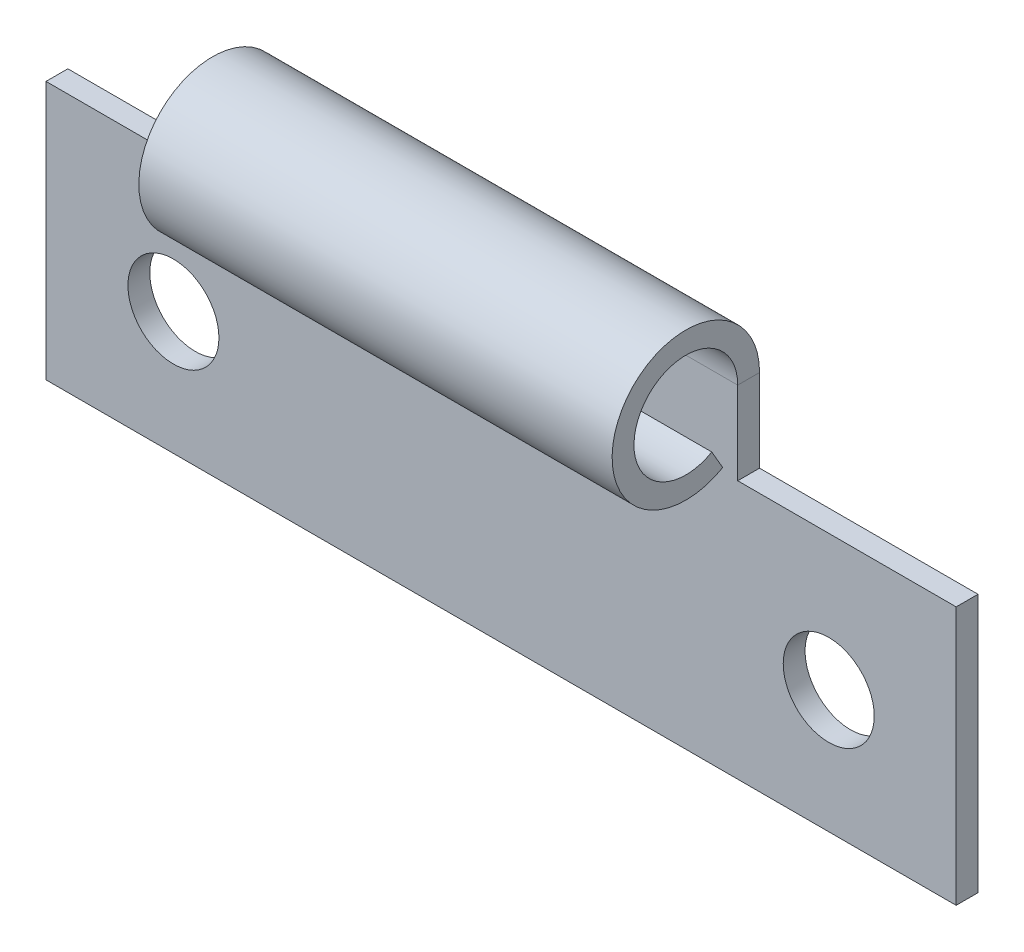
ISO-10303-21;
HEADER;
FILE_DESCRIPTION(('STEP AP214'),'2;1');
FILE_NAME('part.step','',(''),(''),'','','');
FILE_SCHEMA(('AUTOMOTIVE_DESIGN { 1 0 10303 214 1 1 1 1 }'));
ENDSEC;
DATA;
#1=APPLICATION_CONTEXT('core data for automotive mechanical design processes');
#2=APPLICATION_PROTOCOL_DEFINITION('international standard','automotive_design',2000,#1);
#3=PRODUCT_CONTEXT('',#1,'mechanical');
#4=PRODUCT('Part','Part','',(#3));
#5=PRODUCT_RELATED_PRODUCT_CATEGORY('part','',(#4));
#6=PRODUCT_DEFINITION_FORMATION('','',#4);
#7=PRODUCT_DEFINITION_CONTEXT('part definition',#1,'design');
#8=PRODUCT_DEFINITION('design','',#6,#7);
#9=PRODUCT_DEFINITION_SHAPE('','',#8);
#10=(LENGTH_UNIT() NAMED_UNIT(*) SI_UNIT(.MILLI.,.METRE.));
#11=(NAMED_UNIT(*) PLANE_ANGLE_UNIT() SI_UNIT($,.RADIAN.));
#12=(NAMED_UNIT(*) SI_UNIT($,.STERADIAN.) SOLID_ANGLE_UNIT());
#13=UNCERTAINTY_MEASURE_WITH_UNIT(LENGTH_MEASURE(1.E-05),#10,'distance_accuracy_value','');
#14=(GEOMETRIC_REPRESENTATION_CONTEXT(3) GLOBAL_UNCERTAINTY_ASSIGNED_CONTEXT((#13)) GLOBAL_UNIT_ASSIGNED_CONTEXT((#10,
#11,#12)) REPRESENTATION_CONTEXT('',''));
#15=CARTESIAN_POINT('',(0.,0.,0.));
#16=DIRECTION('',(0.,0.,1.));
#17=DIRECTION('',(1.,0.,0.));
#18=AXIS2_PLACEMENT_3D('',#15,#16,#17);
#19=CARTESIAN_POINT('',(-13.,13.425,-1.2));
#20=DIRECTION('',(1.,0.,0.));
#21=DIRECTION('',(0.,1.,0.));
#22=AXIS2_PLACEMENT_3D('',#19,#20,#21);
#23=PLANE('',#22);
#24=DIRECTION('',(0.,1.,0.));
#25=VECTOR('',#24,1.);
#26=CARTESIAN_POINT('',(-13.,0.,0.));
#27=LINE('',#26,#25);
#28=CARTESIAN_POINT('',(-13.,4.825,0.));
#29=VERTEX_POINT('',#28);
#30=CARTESIAN_POINT('',(-13.,9.375,0.));
#31=VERTEX_POINT('',#30);
#32=EDGE_CURVE('E207',#29,#31,#27,.T.);
#33=ORIENTED_EDGE('',*,*,#32,.T.);
#34=DIRECTION('',(0.,0.,-1.));
#35=VECTOR('',#34,1.);
#36=CARTESIAN_POINT('',(-13.,9.375,0.));
#37=LINE('',#36,#35);
#38=CARTESIAN_POINT('',(-13.,9.375,-1.2));
#39=VERTEX_POINT('',#38);
#40=EDGE_CURVE('E12',#31,#39,#37,.T.);
#41=ORIENTED_EDGE('',*,*,#40,.T.);
#42=DIRECTION('',(0.,1.,0.));
#43=VECTOR('',#42,1.);
#44=CARTESIAN_POINT('',(-13.,13.425,-1.2));
#45=LINE('',#44,#43);
#46=CARTESIAN_POINT('',(-13.,4.825,-1.2));
#47=VERTEX_POINT('',#46);
#48=EDGE_CURVE('E129',#47,#39,#45,.T.);
#49=ORIENTED_EDGE('',*,*,#48,.F.);
#50=DIRECTION('',(0.,0.,1.));
#51=VECTOR('',#50,1.);
#52=CARTESIAN_POINT('',(-13.,4.825,-1.2));
#53=LINE('',#52,#51);
#54=EDGE_CURVE('E124',#47,#29,#53,.T.);
#55=ORIENTED_EDGE('',*,*,#54,.T.);
#56=EDGE_LOOP('',(#33,#41,#49,#55));
#57=FACE_BOUND('',#56,.T.);
#58=ADVANCED_FACE('F43',(#57),#23,.F.);
#59=CARTESIAN_POINT('',(13.,13.425,-1.2));
#60=DIRECTION('',(-1.,0.,0.));
#61=DIRECTION('',(0.,-1.,0.));
#62=AXIS2_PLACEMENT_3D('',#59,#60,#61);
#63=PLANE('',#62);
#64=DIRECTION('',(0.,-1.,0.));
#65=VECTOR('',#64,1.);
#66=CARTESIAN_POINT('',(13.,13.425,-1.2));
#67=LINE('',#66,#65);
#68=CARTESIAN_POINT('',(13.,9.375,-1.2));
#69=VERTEX_POINT('',#68);
#70=CARTESIAN_POINT('',(13.,4.825,-1.2));
#71=VERTEX_POINT('',#70);
#72=EDGE_CURVE('E183',#69,#71,#67,.T.);
#73=ORIENTED_EDGE('',*,*,#72,.F.);
#74=DIRECTION('',(0.,0.,1.));
#75=VECTOR('',#74,1.);
#76=CARTESIAN_POINT('',(13.,9.375,-1.2));
#77=LINE('',#76,#75);
#78=CARTESIAN_POINT('',(13.,9.375,0.));
#79=VERTEX_POINT('',#78);
#80=EDGE_CURVE('E51',#69,#79,#77,.T.);
#81=ORIENTED_EDGE('',*,*,#80,.T.);
#82=DIRECTION('',(0.,-1.,0.));
#83=VECTOR('',#82,1.);
#84=CARTESIAN_POINT('',(13.,0.,0.));
#85=LINE('',#84,#83);
#86=CARTESIAN_POINT('',(13.,4.825,0.));
#87=VERTEX_POINT('',#86);
#88=EDGE_CURVE('E180',#79,#87,#85,.T.);
#89=ORIENTED_EDGE('',*,*,#88,.T.);
#90=DIRECTION('',(0.,0.,1.));
#91=VECTOR('',#90,1.);
#92=CARTESIAN_POINT('',(13.,4.825,-1.2));
#93=LINE('',#92,#91);
#94=EDGE_CURVE('E244',#71,#87,#93,.T.);
#95=ORIENTED_EDGE('',*,*,#94,.F.);
#96=EDGE_LOOP('',(#73,#81,#89,#95));
#97=FACE_BOUND('',#96,.T.);
#98=ADVANCED_FACE('F178',(#97),#63,.F.);
#99=CARTESIAN_POINT('',(25.,9.375,-1.2));
#100=DIRECTION('',(1.,0.,0.));
#101=DIRECTION('',(0.,0.,-1.));
#102=AXIS2_PLACEMENT_3D('',#99,#100,#101);
#103=PLANE('',#102);
#104=DIRECTION('',(0.,0.,1.));
#105=VECTOR('',#104,1.);
#106=CARTESIAN_POINT('',(25.,4.825,-1.2));
#107=LINE('',#106,#105);
#108=CARTESIAN_POINT('',(25.,4.825,-1.2));
#109=VERTEX_POINT('',#108);
#110=CARTESIAN_POINT('',(25.,4.825,0.));
#111=VERTEX_POINT('',#110);
#112=EDGE_CURVE('E130',#109,#111,#107,.T.);
#113=ORIENTED_EDGE('',*,*,#112,.T.);
#114=DIRECTION('',(0.,1.,0.));
#115=VECTOR('',#114,1.);
#116=CARTESIAN_POINT('',(25.,9.375,0.));
#117=LINE('',#116,#115);
#118=CARTESIAN_POINT('',(25.,-9.375,0.));
#119=VERTEX_POINT('',#118);
#120=EDGE_CURVE('E154',#119,#111,#117,.T.);
#121=ORIENTED_EDGE('',*,*,#120,.F.);
#122=DIRECTION('',(0.,0.,1.));
#123=VECTOR('',#122,1.);
#124=CARTESIAN_POINT('',(25.,-9.375,-1.2));
#125=LINE('',#124,#123);
#126=CARTESIAN_POINT('',(25.,-9.375,-1.2));
#127=VERTEX_POINT('',#126);
#128=EDGE_CURVE('E165',#127,#119,#125,.T.);
#129=ORIENTED_EDGE('',*,*,#128,.F.);
#130=DIRECTION('',(0.,1.,0.));
#131=VECTOR('',#130,1.);
#132=CARTESIAN_POINT('',(25.,9.375,-1.2));
#133=LINE('',#132,#131);
#134=EDGE_CURVE('E150',#127,#109,#133,.T.);
#135=ORIENTED_EDGE('',*,*,#134,.T.);
#136=EDGE_LOOP('',(#113,#121,#129,#135));
#137=FACE_BOUND('',#136,.T.);
#138=ADVANCED_FACE('F45',(#137),#103,.T.);
#139=CARTESIAN_POINT('',(-25.,-9.375,-1.2));
#140=DIRECTION('',(0.,-1.,0.));
#141=DIRECTION('',(0.,0.,-1.));
#142=AXIS2_PLACEMENT_3D('',#139,#140,#141);
#143=PLANE('',#142);
#144=DIRECTION('',(1.,0.,0.));
#145=VECTOR('',#144,1.);
#146=CARTESIAN_POINT('',(-25.,-9.375,0.));
#147=LINE('',#146,#145);
#148=CARTESIAN_POINT('',(-25.,-9.375,0.));
#149=VERTEX_POINT('',#148);
#150=EDGE_CURVE('E162',#149,#119,#147,.T.);
#151=ORIENTED_EDGE('',*,*,#150,.F.);
#152=DIRECTION('',(0.,0.,1.));
#153=VECTOR('',#152,1.);
#154=CARTESIAN_POINT('',(-25.,-9.375,-1.2));
#155=LINE('',#154,#153);
#156=CARTESIAN_POINT('',(-25.,-9.375,-1.2));
#157=VERTEX_POINT('',#156);
#158=EDGE_CURVE('E147',#157,#149,#155,.T.);
#159=ORIENTED_EDGE('',*,*,#158,.F.);
#160=DIRECTION('',(1.,0.,0.));
#161=VECTOR('',#160,1.);
#162=CARTESIAN_POINT('',(-25.,-9.375,-1.2));
#163=LINE('',#162,#161);
#164=EDGE_CURVE('E144',#157,#127,#163,.T.);
#165=ORIENTED_EDGE('',*,*,#164,.T.);
#166=ORIENTED_EDGE('',*,*,#128,.T.);
#167=EDGE_LOOP('',(#151,#159,#165,#166));
#168=FACE_BOUND('',#167,.T.);
#169=ADVANCED_FACE('F236',(#168),#143,.T.);
#170=CARTESIAN_POINT('',(-25.,9.375,-1.2));
#171=DIRECTION('',(-1.,0.,0.));
#172=DIRECTION('',(0.,-1.,0.));
#173=AXIS2_PLACEMENT_3D('',#170,#171,#172);
#174=PLANE('',#173);
#175=DIRECTION('',(0.,0.,1.));
#176=VECTOR('',#175,1.);
#177=CARTESIAN_POINT('',(-25.,4.825,-1.2));
#178=LINE('',#177,#176);
#179=CARTESIAN_POINT('',(-25.,4.825,-1.2));
#180=VERTEX_POINT('',#179);
#181=CARTESIAN_POINT('',(-25.,4.825,0.));
#182=VERTEX_POINT('',#181);
#183=EDGE_CURVE('E121',#180,#182,#178,.T.);
#184=ORIENTED_EDGE('',*,*,#183,.F.);
#185=DIRECTION('',(0.,-1.,0.));
#186=VECTOR('',#185,1.);
#187=CARTESIAN_POINT('',(-25.,9.375,-1.2));
#188=LINE('',#187,#186);
#189=EDGE_CURVE('E136',#180,#157,#188,.T.);
#190=ORIENTED_EDGE('',*,*,#189,.T.);
#191=ORIENTED_EDGE('',*,*,#158,.T.);
#192=DIRECTION('',(0.,-1.,0.));
#193=VECTOR('',#192,1.);
#194=CARTESIAN_POINT('',(-25.,9.375,0.));
#195=LINE('',#194,#193);
#196=EDGE_CURVE('E138',#182,#149,#195,.T.);
#197=ORIENTED_EDGE('',*,*,#196,.F.);
#198=EDGE_LOOP('',(#184,#190,#191,#197));
#199=FACE_BOUND('',#198,.T.);
#200=ADVANCED_FACE('F134',(#199),#174,.T.);
#201=CARTESIAN_POINT('',(0.,0.,-1.2));
#202=DIRECTION('',(0.,0.,1.));
#203=DIRECTION('',(1.,0.,0.));
#204=AXIS2_PLACEMENT_3D('',#201,#202,#203);
#205=PLANE('',#204);
#206=CARTESIAN_POINT('',(-18.,-2.625,-1.2));
#207=DIRECTION('',(0.,0.,1.));
#208=DIRECTION('',(1.,0.,0.));
#209=AXIS2_PLACEMENT_3D('',#206,#207,#208);
#210=CIRCLE('',#209,2.5);
#211=CARTESIAN_POINT('',(-15.5,-2.625,-1.2));
#212=VERTEX_POINT('',#211);
#213=EDGE_CURVE('E223',#212,#212,#210,.T.);
#214=ORIENTED_EDGE('',*,*,#213,.T.);
#215=EDGE_LOOP('',(#214));
#216=FACE_BOUND('',#215,.T.);
#217=CARTESIAN_POINT('',(18.,-2.62499999999999,-1.2));
#218=DIRECTION('',(0.,0.,1.));
#219=DIRECTION('',(1.,0.,0.));
#220=AXIS2_PLACEMENT_3D('',#217,#218,#219);
#221=CIRCLE('',#220,2.5);
#222=CARTESIAN_POINT('',(20.5,-2.62499999999999,-1.2));
#223=VERTEX_POINT('',#222);
#224=EDGE_CURVE('E218',#223,#223,#221,.T.);
#225=ORIENTED_EDGE('',*,*,#224,.T.);
#226=EDGE_LOOP('',(#225));
#227=FACE_BOUND('',#226,.T.);
#228=DIRECTION('',(1.,0.,0.));
#229=VECTOR('',#228,1.);
#230=CARTESIAN_POINT('',(-25.,4.825,-1.2));
#231=LINE('',#230,#229);
#232=EDGE_CURVE('E118',#180,#47,#231,.T.);
#233=ORIENTED_EDGE('',*,*,#232,.T.);
#234=ORIENTED_EDGE('',*,*,#48,.T.);
#235=DIRECTION('',(-1.,0.,0.));
#236=VECTOR('',#235,1.);
#237=CARTESIAN_POINT('',(-25.,9.375,-1.2));
#238=LINE('',#237,#236);
#239=EDGE_CURVE('E145',#69,#39,#238,.T.);
#240=ORIENTED_EDGE('',*,*,#239,.F.);
#241=ORIENTED_EDGE('',*,*,#72,.T.);
#242=DIRECTION('',(1.,0.,0.));
#243=VECTOR('',#242,1.);
#244=CARTESIAN_POINT('',(25.,4.825,-1.2));
#245=LINE('',#244,#243);
#246=EDGE_CURVE('E233',#71,#109,#245,.T.);
#247=ORIENTED_EDGE('',*,*,#246,.T.);
#248=ORIENTED_EDGE('',*,*,#134,.F.);
#249=ORIENTED_EDGE('',*,*,#164,.F.);
#250=ORIENTED_EDGE('',*,*,#189,.F.);
#251=EDGE_LOOP('',(#233,#234,#240,#241,#247,#248,#249,#250));
#252=FACE_BOUND('',#251,.T.);
#253=ADVANCED_FACE('F141',(#216,#227,#252),#205,.F.);
#254=CARTESIAN_POINT('',(0.,0.,0.));
#255=DIRECTION('',(0.,0.,1.));
#256=DIRECTION('',(1.,0.,0.));
#257=AXIS2_PLACEMENT_3D('',#254,#255,#256);
#258=PLANE('',#257);
#259=ORIENTED_EDGE('',*,*,#32,.F.);
#260=DIRECTION('',(1.,0.,0.));
#261=VECTOR('',#260,1.);
#262=CARTESIAN_POINT('',(0.,4.825,0.));
#263=LINE('',#262,#261);
#264=EDGE_CURVE('E175',#182,#29,#263,.T.);
#265=ORIENTED_EDGE('',*,*,#264,.F.);
#266=ORIENTED_EDGE('',*,*,#196,.T.);
#267=ORIENTED_EDGE('',*,*,#150,.T.);
#268=ORIENTED_EDGE('',*,*,#120,.T.);
#269=DIRECTION('',(1.,0.,0.));
#270=VECTOR('',#269,1.);
#271=CARTESIAN_POINT('',(0.,4.825,0.));
#272=LINE('',#271,#270);
#273=EDGE_CURVE('E173',#87,#111,#272,.T.);
#274=ORIENTED_EDGE('',*,*,#273,.F.);
#275=ORIENTED_EDGE('',*,*,#88,.F.);
#276=DIRECTION('',(-1.,0.,0.));
#277=VECTOR('',#276,1.);
#278=CARTESIAN_POINT('',(-25.,9.375,0.));
#279=LINE('',#278,#277);
#280=EDGE_CURVE('E157',#79,#31,#279,.T.);
#281=ORIENTED_EDGE('',*,*,#280,.T.);
#282=EDGE_LOOP('',(#259,#265,#266,#267,#268,#274,#275,#281));
#283=FACE_BOUND('',#282,.T.);
#284=CARTESIAN_POINT('',(-18.,-2.625,0.));
#285=DIRECTION('',(0.,0.,1.));
#286=DIRECTION('',(1.,0.,0.));
#287=AXIS2_PLACEMENT_3D('',#284,#285,#286);
#288=CIRCLE('',#287,2.5);
#289=CARTESIAN_POINT('',(-15.5,-2.625,0.));
#290=VERTEX_POINT('',#289);
#291=EDGE_CURVE('E215',#290,#290,#288,.T.);
#292=ORIENTED_EDGE('',*,*,#291,.F.);
#293=EDGE_LOOP('',(#292));
#294=FACE_BOUND('',#293,.T.);
#295=CARTESIAN_POINT('',(18.,-2.62499999999999,0.));
#296=DIRECTION('',(0.,0.,1.));
#297=DIRECTION('',(-1.,0.,0.));
#298=AXIS2_PLACEMENT_3D('',#295,#296,#297);
#299=CIRCLE('',#298,2.5);
#300=CARTESIAN_POINT('',(15.5,-2.62499999999999,0.));
#301=VERTEX_POINT('',#300);
#302=EDGE_CURVE('E214',#301,#301,#299,.T.);
#303=ORIENTED_EDGE('',*,*,#302,.F.);
#304=EDGE_LOOP('',(#303));
#305=FACE_BOUND('',#304,.T.);
#306=ADVANCED_FACE('F193',(#283,#294,#305),#258,.T.);
#307=CARTESIAN_POINT('',(0.,6.90682759921437,1.42499999999997));
#308=DIRECTION('',(0.,-0.50000000000001,0.866025403784433));
#309=DIRECTION('',(-1.,0.,0.));
#310=AXIS2_PLACEMENT_3D('',#307,#308,#309);
#311=PLANE('',#310);
#312=DIRECTION('',(0.,0.866025403784433,0.50000000000001));
#313=VECTOR('',#312,1.);
#314=CARTESIAN_POINT('',(-13.,6.90682759921437,1.42499999999997));
#315=LINE('',#314,#313);
#316=CARTESIAN_POINT('',(-13.,6.90682759921437,1.42499999999997));
#317=VERTEX_POINT('',#316);
#318=CARTESIAN_POINT('',(-13.,5.86759711467305,0.824999999999959));
#319=VERTEX_POINT('',#318);
#320=EDGE_CURVE('E201',#317,#319,#315,.F.);
#321=ORIENTED_EDGE('',*,*,#320,.F.);
#322=DIRECTION('',(-1.,0.,0.));
#323=VECTOR('',#322,1.);
#324=CARTESIAN_POINT('',(-25.,6.90682759921437,1.42499999999997));
#325=LINE('',#324,#323);
#326=CARTESIAN_POINT('',(13.,6.90682759921437,1.42499999999997));
#327=VERTEX_POINT('',#326);
#328=EDGE_CURVE('E198',#327,#317,#325,.T.);
#329=ORIENTED_EDGE('',*,*,#328,.F.);
#330=DIRECTION('',(0.,-0.866025403784433,-0.50000000000001));
#331=VECTOR('',#330,1.);
#332=CARTESIAN_POINT('',(13.,6.90682759921437,1.42499999999997));
#333=LINE('',#332,#331);
#334=CARTESIAN_POINT('',(13.,5.86759711467305,0.824999999999961));
#335=VERTEX_POINT('',#334);
#336=EDGE_CURVE('E58',#335,#327,#333,.F.);
#337=ORIENTED_EDGE('',*,*,#336,.F.);
#338=DIRECTION('',(-1.,0.,0.));
#339=VECTOR('',#338,1.);
#340=CARTESIAN_POINT('',(-25.,5.86759711467305,0.824999999999957));
#341=LINE('',#340,#339);
#342=EDGE_CURVE('E158',#335,#319,#341,.T.);
#343=ORIENTED_EDGE('',*,*,#342,.T.);
#344=EDGE_LOOP('',(#321,#329,#337,#343));
#345=FACE_BOUND('',#344,.T.);
#346=ADVANCED_FACE('F205',(#345),#311,.F.);
#347=CARTESIAN_POINT('',(-25.,9.375,2.85));
#348=DIRECTION('',(-1.,0.,0.));
#349=DIRECTION('',(0.,-0.866025403784433,-0.50000000000001));
#350=AXIS2_PLACEMENT_3D('',#347,#348,#349);
#351=CYLINDRICAL_SURFACE('',#350,4.05);
#352=CARTESIAN_POINT('',(-13.,9.375,2.85));
#353=DIRECTION('',(1.,0.,0.));
#354=DIRECTION('',(0.,1.,0.));
#355=AXIS2_PLACEMENT_3D('',#352,#353,#354);
#356=CIRCLE('',#355,4.05);
#357=EDGE_CURVE('E209',#319,#39,#356,.F.);
#358=ORIENTED_EDGE('',*,*,#357,.F.);
#359=ORIENTED_EDGE('',*,*,#342,.F.);
#360=CARTESIAN_POINT('',(13.,9.375,2.85));
#361=DIRECTION('',(-1.,0.,0.));
#362=DIRECTION('',(0.,-1.,0.));
#363=AXIS2_PLACEMENT_3D('',#360,#361,#362);
#364=CIRCLE('',#363,4.05);
#365=EDGE_CURVE('E195',#69,#335,#364,.F.);
#366=ORIENTED_EDGE('',*,*,#365,.F.);
#367=ORIENTED_EDGE('',*,*,#239,.T.);
#368=EDGE_LOOP('',(#358,#359,#366,#367));
#369=FACE_BOUND('',#368,.T.);
#370=ADVANCED_FACE('F250',(#369),#351,.T.);
#371=CARTESIAN_POINT('',(-25.,9.375,2.85));
#372=DIRECTION('',(-1.,0.,0.));
#373=DIRECTION('',(0.,-0.866025403784433,-0.50000000000001));
#374=AXIS2_PLACEMENT_3D('',#371,#372,#373);
#375=CYLINDRICAL_SURFACE('',#374,2.85);
#376=ORIENTED_EDGE('',*,*,#328,.T.);
#377=CARTESIAN_POINT('',(-13.,9.375,2.85));
#378=DIRECTION('',(1.,0.,0.));
#379=DIRECTION('',(0.,1.,0.));
#380=AXIS2_PLACEMENT_3D('',#377,#378,#379);
#381=CIRCLE('',#380,2.85);
#382=EDGE_CURVE('E170',#317,#31,#381,.F.);
#383=ORIENTED_EDGE('',*,*,#382,.T.);
#384=ORIENTED_EDGE('',*,*,#280,.F.);
#385=CARTESIAN_POINT('',(13.,9.375,2.85));
#386=DIRECTION('',(-1.,0.,0.));
#387=DIRECTION('',(0.,-1.,0.));
#388=AXIS2_PLACEMENT_3D('',#385,#386,#387);
#389=CIRCLE('',#388,2.85);
#390=EDGE_CURVE('E167',#79,#327,#389,.F.);
#391=ORIENTED_EDGE('',*,*,#390,.T.);
#392=EDGE_LOOP('',(#376,#383,#384,#391));
#393=FACE_BOUND('',#392,.T.);
#394=ADVANCED_FACE('F197',(#393),#375,.F.);
#395=CARTESIAN_POINT('',(18.,-2.62499999999999,-10.));
#396=DIRECTION('',(0.,0.,1.));
#397=DIRECTION('',(1.,0.,0.));
#398=AXIS2_PLACEMENT_3D('',#395,#396,#397);
#399=CYLINDRICAL_SURFACE('',#398,2.5);
#400=ORIENTED_EDGE('',*,*,#302,.T.);
#401=EDGE_LOOP('',(#400));
#402=FACE_BOUND('',#401,.T.);
#403=ORIENTED_EDGE('',*,*,#224,.F.);
#404=EDGE_LOOP('',(#403));
#405=FACE_BOUND('',#404,.T.);
#406=ADVANCED_FACE('F257',(#402,#405),#399,.F.);
#407=CARTESIAN_POINT('',(-18.,-2.625,-10.));
#408=DIRECTION('',(0.,0.,1.));
#409=DIRECTION('',(1.,0.,0.));
#410=AXIS2_PLACEMENT_3D('',#407,#408,#409);
#411=CYLINDRICAL_SURFACE('',#410,2.5);
#412=ORIENTED_EDGE('',*,*,#291,.T.);
#413=EDGE_LOOP('',(#412));
#414=FACE_BOUND('',#413,.T.);
#415=ORIENTED_EDGE('',*,*,#213,.F.);
#416=EDGE_LOOP('',(#415));
#417=FACE_BOUND('',#416,.T.);
#418=ADVANCED_FACE('F277',(#414,#417),#411,.F.);
#419=CARTESIAN_POINT('',(25.,4.825,-1.2));
#420=DIRECTION('',(0.,-1.,0.));
#421=DIRECTION('',(0.,0.,-1.));
#422=AXIS2_PLACEMENT_3D('',#419,#420,#421);
#423=PLANE('',#422);
#424=ORIENTED_EDGE('',*,*,#273,.T.);
#425=ORIENTED_EDGE('',*,*,#112,.F.);
#426=ORIENTED_EDGE('',*,*,#246,.F.);
#427=ORIENTED_EDGE('',*,*,#94,.T.);
#428=EDGE_LOOP('',(#424,#425,#426,#427));
#429=FACE_BOUND('',#428,.T.);
#430=ADVANCED_FACE('F247',(#429),#423,.F.);
#431=ORIENTED_EDGE('',*,*,#80,.F.);
#432=ORIENTED_EDGE('',*,*,#365,.T.);
#433=ORIENTED_EDGE('',*,*,#336,.T.);
#434=ORIENTED_EDGE('',*,*,#390,.F.);
#435=EDGE_LOOP('',(#431,#432,#433,#434));
#436=FACE_BOUND('',#435,.T.);
#437=ADVANCED_FACE('F185',(#436),#63,.F.);
#438=ORIENTED_EDGE('',*,*,#40,.F.);
#439=ORIENTED_EDGE('',*,*,#382,.F.);
#440=ORIENTED_EDGE('',*,*,#320,.T.);
#441=ORIENTED_EDGE('',*,*,#357,.T.);
#442=EDGE_LOOP('',(#438,#439,#440,#441));
#443=FACE_BOUND('',#442,.T.);
#444=ADVANCED_FACE('F200',(#443),#23,.F.);
#445=CARTESIAN_POINT('',(-25.,4.825,-1.2));
#446=DIRECTION('',(0.,-1.,0.));
#447=DIRECTION('',(0.,0.,-1.));
#448=AXIS2_PLACEMENT_3D('',#445,#446,#447);
#449=PLANE('',#448);
#450=ORIENTED_EDGE('',*,*,#264,.T.);
#451=ORIENTED_EDGE('',*,*,#54,.F.);
#452=ORIENTED_EDGE('',*,*,#232,.F.);
#453=ORIENTED_EDGE('',*,*,#183,.T.);
#454=EDGE_LOOP('',(#450,#451,#452,#453));
#455=FACE_BOUND('',#454,.T.);
#456=ADVANCED_FACE('F120',(#455),#449,.F.);
#457=CLOSED_SHELL('',(#58,#98,#138,#169,#200,#253,#306,#346,#370,#394,#406,#418,#430,#437,#444,#456));
#458=MANIFOLD_SOLID_BREP('B2',#457);
#459=ADVANCED_BREP_SHAPE_REPRESENTATION('',(#18,#458),#14);
#460=SHAPE_DEFINITION_REPRESENTATION(#9,#459);
ENDSEC;
END-ISO-10303-21;
